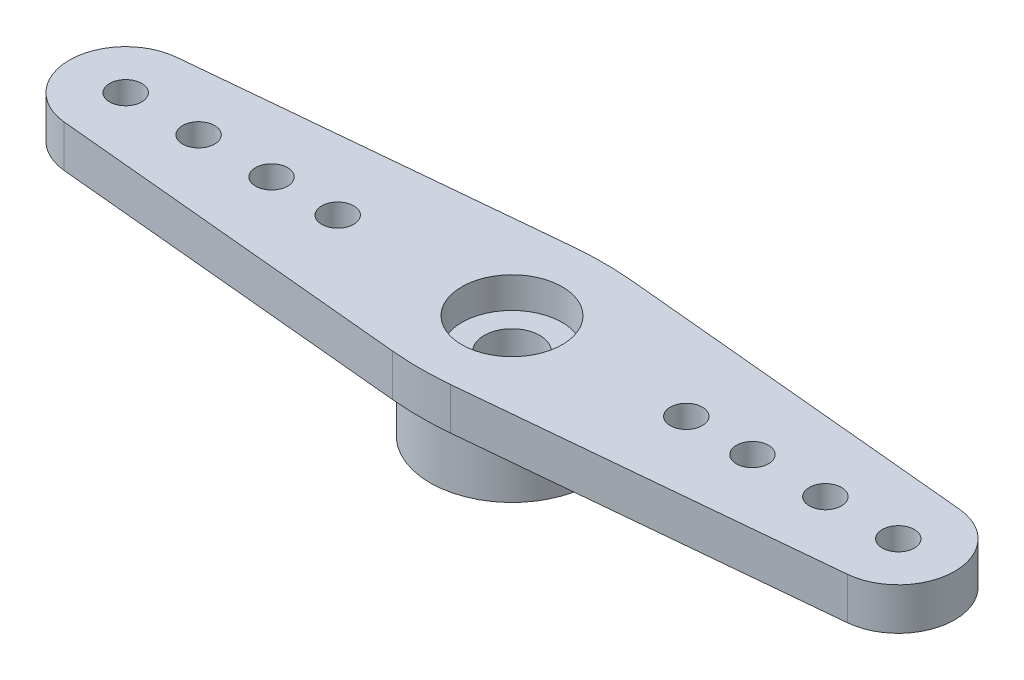
ISO-10303-21;
HEADER;
FILE_DESCRIPTION(('STEP AP214'),'2;1');
FILE_NAME('part.step','',(''),(''),'','','');
FILE_SCHEMA(('AUTOMOTIVE_DESIGN { 1 0 10303 214 1 1 1 1 }'));
ENDSEC;
DATA;
#1=APPLICATION_CONTEXT('core data for automotive mechanical design processes');
#2=APPLICATION_PROTOCOL_DEFINITION('international standard','automotive_design',2000,#1);
#3=PRODUCT_CONTEXT('',#1,'mechanical');
#4=PRODUCT('Part','Part','',(#3));
#5=PRODUCT_RELATED_PRODUCT_CATEGORY('part','',(#4));
#6=PRODUCT_DEFINITION_FORMATION('','',#4);
#7=PRODUCT_DEFINITION_CONTEXT('part definition',#1,'design');
#8=PRODUCT_DEFINITION('design','',#6,#7);
#9=PRODUCT_DEFINITION_SHAPE('','',#8);
#10=(LENGTH_UNIT() NAMED_UNIT(*) SI_UNIT(.MILLI.,.METRE.));
#11=(NAMED_UNIT(*) PLANE_ANGLE_UNIT() SI_UNIT($,.RADIAN.));
#12=(NAMED_UNIT(*) SI_UNIT($,.STERADIAN.) SOLID_ANGLE_UNIT());
#13=UNCERTAINTY_MEASURE_WITH_UNIT(LENGTH_MEASURE(1.E-05),#10,'distance_accuracy_value','');
#14=(GEOMETRIC_REPRESENTATION_CONTEXT(3) GLOBAL_UNCERTAINTY_ASSIGNED_CONTEXT((#13)) GLOBAL_UNIT_ASSIGNED_CONTEXT((#10,
#11,#12)) REPRESENTATION_CONTEXT('',''));
#15=CARTESIAN_POINT('',(0.,0.,0.));
#16=DIRECTION('',(0.,0.,1.));
#17=DIRECTION('',(1.,0.,0.));
#18=AXIS2_PLACEMENT_3D('',#15,#16,#17);
#19=CARTESIAN_POINT('',(0.,4.2672,0.));
#20=DIRECTION('',(0.,-1.,0.));
#21=DIRECTION('',(0.,0.,-1.));
#22=AXIS2_PLACEMENT_3D('',#19,#20,#21);
#23=CYLINDRICAL_SURFACE('',#22,1.143);
#24=CARTESIAN_POINT('',(0.,2.9972,0.));
#25=DIRECTION('',(0.,1.,0.));
#26=DIRECTION('',(0.,0.,1.));
#27=AXIS2_PLACEMENT_3D('',#24,#25,#26);
#28=CIRCLE('',#27,1.143);
#29=CARTESIAN_POINT('',(0.,2.9972,1.143));
#30=VERTEX_POINT('',#29);
#31=EDGE_CURVE('E324',#30,#30,#28,.F.);
#32=ORIENTED_EDGE('',*,*,#31,.F.);
#33=EDGE_LOOP('',(#32));
#34=FACE_BOUND('',#33,.T.);
#35=CARTESIAN_POINT('',(0.,-0.73,0.));
#36=DIRECTION('',(0.,-1.,0.));
#37=DIRECTION('',(0.,0.,-1.));
#38=AXIS2_PLACEMENT_3D('',#35,#36,#37);
#39=CIRCLE('',#38,1.143);
#40=CARTESIAN_POINT('',(0.,-0.73,-1.143));
#41=VERTEX_POINT('',#40);
#42=EDGE_CURVE('E327',#41,#41,#39,.T.);
#43=ORIENTED_EDGE('',*,*,#42,.T.);
#44=EDGE_LOOP('',(#43));
#45=FACE_BOUND('',#44,.T.);
#46=ADVANCED_FACE('F34',(#34,#45),#23,.F.);
#47=CARTESIAN_POINT('',(0.,0.,0.));
#48=DIRECTION('',(0.,1.,0.));
#49=DIRECTION('',(0.,0.,1.));
#50=AXIS2_PLACEMENT_3D('',#47,#48,#49);
#51=PLANE('',#50);
#52=CARTESIAN_POINT('',(0.,0.,0.));
#53=DIRECTION('',(0.,1.,0.));
#54=DIRECTION('',(0.,0.,1.));
#55=AXIS2_PLACEMENT_3D('',#52,#53,#54);
#56=CIRCLE('',#55,3.3655);
#57=CARTESIAN_POINT('',(0.,0.,3.3655));
#58=VERTEX_POINT('',#57);
#59=EDGE_CURVE('E119',#58,#58,#56,.T.);
#60=ORIENTED_EDGE('',*,*,#59,.F.);
#61=EDGE_LOOP('',(#60));
#62=FACE_BOUND('',#61,.T.);
#63=CARTESIAN_POINT('',(0.,0.,0.));
#64=DIRECTION('',(0.,1.,0.));
#65=DIRECTION('',(0.,0.,1.));
#66=AXIS2_PLACEMENT_3D('',#63,#64,#65);
#67=CIRCLE('',#66,2.2352);
#68=CARTESIAN_POINT('',(0.,0.,2.2352));
#69=VERTEX_POINT('',#68);
#70=EDGE_CURVE('E318',#69,#69,#67,.F.);
#71=ORIENTED_EDGE('',*,*,#70,.F.);
#72=EDGE_LOOP('',(#71));
#73=FACE_BOUND('',#72,.T.);
#74=ADVANCED_FACE('F247',(#62,#73),#51,.F.);
#75=CARTESIAN_POINT('',(0.,2.54,0.));
#76=DIRECTION('',(0.,-1.,0.));
#77=DIRECTION('',(0.,0.,-1.));
#78=AXIS2_PLACEMENT_3D('',#75,#76,#77);
#79=CYLINDRICAL_SURFACE('',#78,3.3655);
#80=CARTESIAN_POINT('',(0.,2.54,0.));
#81=DIRECTION('',(0.,1.,0.));
#82=DIRECTION('',(0.,0.,1.));
#83=AXIS2_PLACEMENT_3D('',#80,#81,#82);
#84=CIRCLE('',#83,3.3655);
#85=CARTESIAN_POINT('',(0.,2.54,3.3655));
#86=VERTEX_POINT('',#85);
#87=EDGE_CURVE('E202',#86,#86,#84,.T.);
#88=ORIENTED_EDGE('',*,*,#87,.F.);
#89=EDGE_LOOP('',(#88));
#90=FACE_BOUND('',#89,.T.);
#91=ORIENTED_EDGE('',*,*,#59,.T.);
#92=EDGE_LOOP('',(#91));
#93=FACE_BOUND('',#92,.T.);
#94=ADVANCED_FACE('F253',(#90,#93),#79,.T.);
#95=CARTESIAN_POINT('',(-29.0607200096115,2.54,0.));
#96=DIRECTION('',(0.,1.,0.));
#97=DIRECTION('',(0.,0.,1.));
#98=AXIS2_PLACEMENT_3D('',#95,#96,#97);
#99=PLANE('',#98);
#100=CARTESIAN_POINT('',(-9.8806,2.54,0.));
#101=DIRECTION('',(0.,1.,0.));
#102=DIRECTION('',(0.,0.,1.));
#103=AXIS2_PLACEMENT_3D('',#100,#101,#102);
#104=CIRCLE('',#103,0.6604);
#105=CARTESIAN_POINT('',(-9.8806,2.54,0.6604));
#106=VERTEX_POINT('',#105);
#107=EDGE_CURVE('E159',#106,#106,#104,.F.);
#108=ORIENTED_EDGE('',*,*,#107,.F.);
#109=EDGE_LOOP('',(#108));
#110=FACE_BOUND('',#109,.T.);
#111=DIRECTION('',(-0.995596740434201,0.,0.0937396950965555));
#112=VECTOR('',#111,1.);
#113=CARTESIAN_POINT('',(-29.162120546294,2.54,-1.07696151236052));
#114=LINE('',#113,#112);
#115=CARTESIAN_POINT('',(-1.19049412772623,2.54,-3.71060988156648));
#116=VERTEX_POINT('',#115);
#117=CARTESIAN_POINT('',(-16.09226517831,2.54,-2.30754434514137));
#118=VERTEX_POINT('',#117);
#119=EDGE_CURVE('E115',#116,#118,#114,.T.);
#120=ORIENTED_EDGE('',*,*,#119,.F.);
#121=CARTESIAN_POINT('',(0.,2.54,8.93346872194787));
#122=DIRECTION('',(0.,1.,0.));
#123=DIRECTION('',(0.,0.,1.));
#124=AXIS2_PLACEMENT_3D('',#121,#122,#123);
#125=CIRCLE('',#124,12.7);
#126=CARTESIAN_POINT('',(1.19049412772628,2.54,-3.71060988156648));
#127=VERTEX_POINT('',#126);
#128=EDGE_CURVE('E211',#116,#127,#125,.F.);
#129=ORIENTED_EDGE('',*,*,#128,.T.);
#130=DIRECTION('',(0.995596740434201,0.,0.0937396950965555));
#131=VECTOR('',#130,1.);
#132=CARTESIAN_POINT('',(-28.4485987983057,2.54,-6.50125736059801));
#133=LINE('',#132,#131);
#134=CARTESIAN_POINT('',(16.09226517831,2.54,-2.30754434514137));
#135=VERTEX_POINT('',#134);
#136=EDGE_CURVE('E173',#127,#135,#133,.T.);
#137=ORIENTED_EDGE('',*,*,#136,.T.);
#138=CARTESIAN_POINT('',(15.875,2.54,0.));
#139=DIRECTION('',(0.,1.,0.));
#140=DIRECTION('',(0.,0.,1.));
#141=AXIS2_PLACEMENT_3D('',#138,#139,#140);
#142=CIRCLE('',#141,2.31775);
#143=CARTESIAN_POINT('',(16.09226517831,2.54,2.30754434514137));
#144=VERTEX_POINT('',#143);
#145=EDGE_CURVE('E170',#144,#135,#142,.T.);
#146=ORIENTED_EDGE('',*,*,#145,.F.);
#147=DIRECTION('',(0.995596740434201,0.,-0.0937396950965555));
#148=VECTOR('',#147,1.);
#149=CARTESIAN_POINT('',(-28.4485987983057,2.54,6.50125736059801));
#150=LINE('',#149,#148);
#151=CARTESIAN_POINT('',(1.19049412772627,2.54,3.71060988156648));
#152=VERTEX_POINT('',#151);
#153=EDGE_CURVE('E168',#152,#144,#150,.T.);
#154=ORIENTED_EDGE('',*,*,#153,.F.);
#155=CARTESIAN_POINT('',(0.,2.54,-8.93346872194787));
#156=DIRECTION('',(0.,1.,0.));
#157=DIRECTION('',(0.,0.,1.));
#158=AXIS2_PLACEMENT_3D('',#155,#156,#157);
#159=CIRCLE('',#158,12.7);
#160=CARTESIAN_POINT('',(-1.19049412772624,2.54,3.71060988156648));
#161=VERTEX_POINT('',#160);
#162=EDGE_CURVE('E209',#152,#161,#159,.F.);
#163=ORIENTED_EDGE('',*,*,#162,.T.);
#164=DIRECTION('',(-0.995596740434201,0.,-0.0937396950965555));
#165=VECTOR('',#164,1.);
#166=CARTESIAN_POINT('',(-29.162120546294,2.54,1.07696151236052));
#167=LINE('',#166,#165);
#168=CARTESIAN_POINT('',(-16.09226517831,2.54,2.30754434514137));
#169=VERTEX_POINT('',#168);
#170=EDGE_CURVE('E166',#161,#169,#167,.T.);
#171=ORIENTED_EDGE('',*,*,#170,.T.);
#172=CARTESIAN_POINT('',(-15.875,2.54,0.));
#173=DIRECTION('',(0.,1.,0.));
#174=DIRECTION('',(0.,0.,1.));
#175=AXIS2_PLACEMENT_3D('',#172,#173,#174);
#176=CIRCLE('',#175,2.31775);
#177=EDGE_CURVE('E164',#169,#118,#176,.F.);
#178=ORIENTED_EDGE('',*,*,#177,.T.);
#179=EDGE_LOOP('',(#120,#129,#137,#146,#154,#163,#171,#178));
#180=FACE_BOUND('',#179,.T.);
#181=CARTESIAN_POINT('',(-7.1628,2.54,0.));
#182=DIRECTION('',(0.,1.,0.));
#183=DIRECTION('',(0.,0.,1.));
#184=AXIS2_PLACEMENT_3D('',#181,#182,#183);
#185=CIRCLE('',#184,0.6604);
#186=CARTESIAN_POINT('',(-7.1628,2.54,0.6604));
#187=VERTEX_POINT('',#186);
#188=EDGE_CURVE('E175',#187,#187,#185,.F.);
#189=ORIENTED_EDGE('',*,*,#188,.F.);
#190=EDGE_LOOP('',(#189));
#191=FACE_BOUND('',#190,.T.);
#192=CARTESIAN_POINT('',(-12.8778,2.54,0.));
#193=DIRECTION('',(0.,1.,0.));
#194=DIRECTION('',(0.,0.,1.));
#195=AXIS2_PLACEMENT_3D('',#192,#193,#194);
#196=CIRCLE('',#195,0.660399999999998);
#197=CARTESIAN_POINT('',(-12.8778,2.54,0.660399999999998));
#198=VERTEX_POINT('',#197);
#199=EDGE_CURVE('E178',#198,#198,#196,.F.);
#200=ORIENTED_EDGE('',*,*,#199,.F.);
#201=EDGE_LOOP('',(#200));
#202=FACE_BOUND('',#201,.T.);
#203=CARTESIAN_POINT('',(-15.875,2.54,0.));
#204=DIRECTION('',(0.,1.,0.));
#205=DIRECTION('',(0.,0.,1.));
#206=AXIS2_PLACEMENT_3D('',#203,#204,#205);
#207=CIRCLE('',#206,0.660399999999998);
#208=CARTESIAN_POINT('',(-15.875,2.54,0.660399999999998));
#209=VERTEX_POINT('',#208);
#210=EDGE_CURVE('E181',#209,#209,#207,.F.);
#211=ORIENTED_EDGE('',*,*,#210,.F.);
#212=EDGE_LOOP('',(#211));
#213=FACE_BOUND('',#212,.T.);
#214=CARTESIAN_POINT('',(12.8778,2.54,0.));
#215=DIRECTION('',(0.,1.,0.));
#216=DIRECTION('',(0.,0.,1.));
#217=AXIS2_PLACEMENT_3D('',#214,#215,#216);
#218=CIRCLE('',#217,0.660399999999998);
#219=CARTESIAN_POINT('',(12.8778,2.54,0.660399999999998));
#220=VERTEX_POINT('',#219);
#221=EDGE_CURVE('E184',#220,#220,#218,.T.);
#222=ORIENTED_EDGE('',*,*,#221,.T.);
#223=EDGE_LOOP('',(#222));
#224=FACE_BOUND('',#223,.T.);
#225=CARTESIAN_POINT('',(9.8806,2.54,0.));
#226=DIRECTION('',(0.,1.,0.));
#227=DIRECTION('',(0.,0.,1.));
#228=AXIS2_PLACEMENT_3D('',#225,#226,#227);
#229=CIRCLE('',#228,0.6604);
#230=CARTESIAN_POINT('',(9.8806,2.54,0.6604));
#231=VERTEX_POINT('',#230);
#232=EDGE_CURVE('E187',#231,#231,#229,.T.);
#233=ORIENTED_EDGE('',*,*,#232,.T.);
#234=EDGE_LOOP('',(#233));
#235=FACE_BOUND('',#234,.T.);
#236=CARTESIAN_POINT('',(7.1628,2.54,0.));
#237=DIRECTION('',(0.,1.,0.));
#238=DIRECTION('',(0.,0.,1.));
#239=AXIS2_PLACEMENT_3D('',#236,#237,#238);
#240=CIRCLE('',#239,0.6604);
#241=CARTESIAN_POINT('',(7.1628,2.54,0.6604));
#242=VERTEX_POINT('',#241);
#243=EDGE_CURVE('E190',#242,#242,#240,.T.);
#244=ORIENTED_EDGE('',*,*,#243,.T.);
#245=EDGE_LOOP('',(#244));
#246=FACE_BOUND('',#245,.T.);
#247=CARTESIAN_POINT('',(15.875,2.54,0.));
#248=DIRECTION('',(0.,1.,0.));
#249=DIRECTION('',(0.,0.,1.));
#250=AXIS2_PLACEMENT_3D('',#247,#248,#249);
#251=CIRCLE('',#250,0.660399999999998);
#252=CARTESIAN_POINT('',(15.875,2.54,0.660399999999998));
#253=VERTEX_POINT('',#252);
#254=EDGE_CURVE('E193',#253,#253,#251,.T.);
#255=ORIENTED_EDGE('',*,*,#254,.T.);
#256=EDGE_LOOP('',(#255));
#257=FACE_BOUND('',#256,.T.);
#258=ORIENTED_EDGE('',*,*,#87,.T.);
#259=EDGE_LOOP('',(#258));
#260=FACE_BOUND('',#259,.T.);
#261=ADVANCED_FACE('F225',(#110,#180,#191,#202,#213,#224,#235,#246,#257,#260),#99,.F.);
#262=CARTESIAN_POINT('',(-29.162120546294,4.2672,-1.07696151236052));
#263=DIRECTION('',(0.0937396950965555,0.,0.995596740434201));
#264=DIRECTION('',(0.995596740434201,0.,-0.0937396950965555));
#265=AXIS2_PLACEMENT_3D('',#262,#263,#264);
#266=PLANE('',#265);
#267=DIRECTION('',(-0.995596740434201,0.,0.0937396950965555));
#268=VECTOR('',#267,1.);
#269=CARTESIAN_POINT('',(-29.162120546294,4.2672,-1.07696151236052));
#270=LINE('',#269,#268);
#271=CARTESIAN_POINT('',(-1.19049412772623,4.2672,-3.71060988156648));
#272=VERTEX_POINT('',#271);
#273=CARTESIAN_POINT('',(-16.09226517831,4.2672,-2.30754434514137));
#274=VERTEX_POINT('',#273);
#275=EDGE_CURVE('E97',#272,#274,#270,.T.);
#276=ORIENTED_EDGE('',*,*,#275,.F.);
#277=DIRECTION('',(0.,-1.,0.));
#278=VECTOR('',#277,1.);
#279=CARTESIAN_POINT('',(-1.19049412772624,2.54,-3.71060988156648));
#280=LINE('',#279,#278);
#281=EDGE_CURVE('E205',#272,#116,#280,.T.);
#282=ORIENTED_EDGE('',*,*,#281,.T.);
#283=ORIENTED_EDGE('',*,*,#119,.T.);
#284=DIRECTION('',(0.,-1.,0.));
#285=VECTOR('',#284,1.);
#286=CARTESIAN_POINT('',(-16.09226517831,4.2672,-2.30754434514137));
#287=LINE('',#286,#285);
#288=EDGE_CURVE('E112',#274,#118,#287,.T.);
#289=ORIENTED_EDGE('',*,*,#288,.F.);
#290=EDGE_LOOP('',(#276,#282,#283,#289));
#291=FACE_BOUND('',#290,.T.);
#292=ADVANCED_FACE('F113',(#291),#266,.F.);
#293=CARTESIAN_POINT('',(-15.875,4.2672,0.));
#294=DIRECTION('',(0.,-1.,0.));
#295=DIRECTION('',(0.,0.,-1.));
#296=AXIS2_PLACEMENT_3D('',#293,#294,#295);
#297=CYLINDRICAL_SURFACE('',#296,2.31775);
#298=ORIENTED_EDGE('',*,*,#177,.F.);
#299=DIRECTION('',(0.,-1.,0.));
#300=VECTOR('',#299,1.);
#301=CARTESIAN_POINT('',(-16.09226517831,4.2672,2.30754434514137));
#302=LINE('',#301,#300);
#303=CARTESIAN_POINT('',(-16.09226517831,4.2672,2.30754434514137));
#304=VERTEX_POINT('',#303);
#305=EDGE_CURVE('E120',#304,#169,#302,.T.);
#306=ORIENTED_EDGE('',*,*,#305,.F.);
#307=CARTESIAN_POINT('',(-15.875,4.2672,0.));
#308=DIRECTION('',(0.,1.,0.));
#309=DIRECTION('',(0.,0.,1.));
#310=AXIS2_PLACEMENT_3D('',#307,#308,#309);
#311=CIRCLE('',#310,2.31775);
#312=EDGE_CURVE('E103',#304,#274,#311,.F.);
#313=ORIENTED_EDGE('',*,*,#312,.T.);
#314=ORIENTED_EDGE('',*,*,#288,.T.);
#315=EDGE_LOOP('',(#298,#306,#313,#314));
#316=FACE_BOUND('',#315,.T.);
#317=ADVANCED_FACE('F123',(#316),#297,.T.);
#318=CARTESIAN_POINT('',(-29.162120546294,4.2672,1.07696151236052));
#319=DIRECTION('',(-0.0937396950965555,0.,0.995596740434201));
#320=DIRECTION('',(0.995596740434201,0.,0.0937396950965555));
#321=AXIS2_PLACEMENT_3D('',#318,#319,#320);
#322=PLANE('',#321);
#323=ORIENTED_EDGE('',*,*,#170,.F.);
#324=DIRECTION('',(0.,-1.,0.));
#325=VECTOR('',#324,1.);
#326=CARTESIAN_POINT('',(-1.19049412772625,4.2672,3.71060988156648));
#327=LINE('',#326,#325);
#328=CARTESIAN_POINT('',(-1.19049412772624,4.2672,3.71060988156648));
#329=VERTEX_POINT('',#328);
#330=EDGE_CURVE('E11',#161,#329,#327,.F.);
#331=ORIENTED_EDGE('',*,*,#330,.T.);
#332=DIRECTION('',(-0.995596740434201,0.,-0.0937396950965555));
#333=VECTOR('',#332,1.);
#334=CARTESIAN_POINT('',(-29.162120546294,4.2672,1.07696151236052));
#335=LINE('',#334,#333);
#336=EDGE_CURVE('E125',#329,#304,#335,.T.);
#337=ORIENTED_EDGE('',*,*,#336,.T.);
#338=ORIENTED_EDGE('',*,*,#305,.T.);
#339=EDGE_LOOP('',(#323,#331,#337,#338));
#340=FACE_BOUND('',#339,.T.);
#341=ADVANCED_FACE('F236',(#340),#322,.T.);
#342=CARTESIAN_POINT('',(-28.4485987983057,4.2672,6.50125736059801));
#343=DIRECTION('',(-0.0937396950965555,0.,-0.995596740434201));
#344=DIRECTION('',(-0.995596740434201,0.,0.0937396950965555));
#345=AXIS2_PLACEMENT_3D('',#342,#343,#344);
#346=PLANE('',#345);
#347=DIRECTION('',(0.995596740434201,0.,-0.0937396950965555));
#348=VECTOR('',#347,1.);
#349=CARTESIAN_POINT('',(-28.4485987983057,4.2672,6.50125736059801));
#350=LINE('',#349,#348);
#351=CARTESIAN_POINT('',(1.19049412772627,4.2672,3.71060988156648));
#352=VERTEX_POINT('',#351);
#353=CARTESIAN_POINT('',(16.09226517831,4.2672,2.30754434514137));
#354=VERTEX_POINT('',#353);
#355=EDGE_CURVE('E127',#352,#354,#350,.T.);
#356=ORIENTED_EDGE('',*,*,#355,.F.);
#357=DIRECTION('',(0.,-1.,0.));
#358=VECTOR('',#357,1.);
#359=CARTESIAN_POINT('',(1.19049412772626,2.54,3.71060988156648));
#360=LINE('',#359,#358);
#361=EDGE_CURVE('E42',#352,#152,#360,.T.);
#362=ORIENTED_EDGE('',*,*,#361,.T.);
#363=ORIENTED_EDGE('',*,*,#153,.T.);
#364=DIRECTION('',(0.,-1.,0.));
#365=VECTOR('',#364,1.);
#366=CARTESIAN_POINT('',(16.09226517831,4.2672,2.30754434514137));
#367=LINE('',#366,#365);
#368=EDGE_CURVE('E198',#354,#144,#367,.T.);
#369=ORIENTED_EDGE('',*,*,#368,.F.);
#370=EDGE_LOOP('',(#356,#362,#363,#369));
#371=FACE_BOUND('',#370,.T.);
#372=ADVANCED_FACE('F220',(#371),#346,.F.);
#373=CARTESIAN_POINT('',(15.875,4.2672,0.));
#374=DIRECTION('',(0.,-1.,0.));
#375=DIRECTION('',(0.,0.,-1.));
#376=AXIS2_PLACEMENT_3D('',#373,#374,#375);
#377=CYLINDRICAL_SURFACE('',#376,2.31775);
#378=ORIENTED_EDGE('',*,*,#145,.T.);
#379=DIRECTION('',(0.,-1.,0.));
#380=VECTOR('',#379,1.);
#381=CARTESIAN_POINT('',(16.09226517831,4.2672,-2.30754434514137));
#382=LINE('',#381,#380);
#383=CARTESIAN_POINT('',(16.09226517831,4.2672,-2.30754434514137));
#384=VERTEX_POINT('',#383);
#385=EDGE_CURVE('E158',#384,#135,#382,.T.);
#386=ORIENTED_EDGE('',*,*,#385,.F.);
#387=CARTESIAN_POINT('',(15.875,4.2672,0.));
#388=DIRECTION('',(0.,1.,0.));
#389=DIRECTION('',(0.,0.,1.));
#390=AXIS2_PLACEMENT_3D('',#387,#388,#389);
#391=CIRCLE('',#390,2.31775);
#392=EDGE_CURVE('E132',#354,#384,#391,.T.);
#393=ORIENTED_EDGE('',*,*,#392,.F.);
#394=ORIENTED_EDGE('',*,*,#368,.T.);
#395=EDGE_LOOP('',(#378,#386,#393,#394));
#396=FACE_BOUND('',#395,.T.);
#397=ADVANCED_FACE('F230',(#396),#377,.T.);
#398=CARTESIAN_POINT('',(15.875,4.2672,0.));
#399=DIRECTION('',(0.,-1.,0.));
#400=DIRECTION('',(0.,0.,-1.));
#401=AXIS2_PLACEMENT_3D('',#398,#399,#400);
#402=CYLINDRICAL_SURFACE('',#401,0.660399999999998);
#403=CARTESIAN_POINT('',(15.875,4.2672,0.));
#404=DIRECTION('',(0.,1.,0.));
#405=DIRECTION('',(0.,0.,1.));
#406=AXIS2_PLACEMENT_3D('',#403,#404,#405);
#407=CIRCLE('',#406,0.660399999999998);
#408=CARTESIAN_POINT('',(15.875,4.2672,0.660399999999998));
#409=VERTEX_POINT('',#408);
#410=EDGE_CURVE('E155',#409,#409,#407,.T.);
#411=ORIENTED_EDGE('',*,*,#410,.T.);
#412=EDGE_LOOP('',(#411));
#413=FACE_BOUND('',#412,.T.);
#414=ORIENTED_EDGE('',*,*,#254,.F.);
#415=EDGE_LOOP('',(#414));
#416=FACE_BOUND('',#415,.T.);
#417=ADVANCED_FACE('F261',(#413,#416),#402,.F.);
#418=CARTESIAN_POINT('',(7.1628,4.2672,0.));
#419=DIRECTION('',(0.,-1.,0.));
#420=DIRECTION('',(0.,0.,-1.));
#421=AXIS2_PLACEMENT_3D('',#418,#419,#420);
#422=CYLINDRICAL_SURFACE('',#421,0.6604);
#423=CARTESIAN_POINT('',(7.1628,4.2672,0.));
#424=DIRECTION('',(0.,1.,0.));
#425=DIRECTION('',(0.,0.,1.));
#426=AXIS2_PLACEMENT_3D('',#423,#424,#425);
#427=CIRCLE('',#426,0.6604);
#428=CARTESIAN_POINT('',(7.1628,4.2672,0.6604));
#429=VERTEX_POINT('',#428);
#430=EDGE_CURVE('E152',#429,#429,#427,.T.);
#431=ORIENTED_EDGE('',*,*,#430,.T.);
#432=EDGE_LOOP('',(#431));
#433=FACE_BOUND('',#432,.T.);
#434=ORIENTED_EDGE('',*,*,#243,.F.);
#435=EDGE_LOOP('',(#434));
#436=FACE_BOUND('',#435,.T.);
#437=ADVANCED_FACE('F264',(#433,#436),#422,.F.);
#438=CARTESIAN_POINT('',(9.8806,4.2672,0.));
#439=DIRECTION('',(0.,-1.,0.));
#440=DIRECTION('',(0.,0.,-1.));
#441=AXIS2_PLACEMENT_3D('',#438,#439,#440);
#442=CYLINDRICAL_SURFACE('',#441,0.6604);
#443=CARTESIAN_POINT('',(9.8806,4.2672,0.));
#444=DIRECTION('',(0.,1.,0.));
#445=DIRECTION('',(0.,0.,1.));
#446=AXIS2_PLACEMENT_3D('',#443,#444,#445);
#447=CIRCLE('',#446,0.6604);
#448=CARTESIAN_POINT('',(9.8806,4.2672,0.6604));
#449=VERTEX_POINT('',#448);
#450=EDGE_CURVE('E149',#449,#449,#447,.T.);
#451=ORIENTED_EDGE('',*,*,#450,.T.);
#452=EDGE_LOOP('',(#451));
#453=FACE_BOUND('',#452,.T.);
#454=ORIENTED_EDGE('',*,*,#232,.F.);
#455=EDGE_LOOP('',(#454));
#456=FACE_BOUND('',#455,.T.);
#457=ADVANCED_FACE('F268',(#453,#456),#442,.F.);
#458=CARTESIAN_POINT('',(12.8778,4.2672,0.));
#459=DIRECTION('',(0.,-1.,0.));
#460=DIRECTION('',(0.,0.,-1.));
#461=AXIS2_PLACEMENT_3D('',#458,#459,#460);
#462=CYLINDRICAL_SURFACE('',#461,0.660399999999998);
#463=CARTESIAN_POINT('',(12.8778,4.2672,0.));
#464=DIRECTION('',(0.,1.,0.));
#465=DIRECTION('',(0.,0.,1.));
#466=AXIS2_PLACEMENT_3D('',#463,#464,#465);
#467=CIRCLE('',#466,0.660399999999998);
#468=CARTESIAN_POINT('',(12.8778,4.2672,0.660399999999998));
#469=VERTEX_POINT('',#468);
#470=EDGE_CURVE('E146',#469,#469,#467,.T.);
#471=ORIENTED_EDGE('',*,*,#470,.T.);
#472=EDGE_LOOP('',(#471));
#473=FACE_BOUND('',#472,.T.);
#474=ORIENTED_EDGE('',*,*,#221,.F.);
#475=EDGE_LOOP('',(#474));
#476=FACE_BOUND('',#475,.T.);
#477=ADVANCED_FACE('F272',(#473,#476),#462,.F.);
#478=CARTESIAN_POINT('',(-15.875,4.2672,0.));
#479=DIRECTION('',(0.,-1.,0.));
#480=DIRECTION('',(0.,0.,-1.));
#481=AXIS2_PLACEMENT_3D('',#478,#479,#480);
#482=CYLINDRICAL_SURFACE('',#481,0.660399999999998);
#483=CARTESIAN_POINT('',(-15.875,4.2672,0.));
#484=DIRECTION('',(0.,1.,0.));
#485=DIRECTION('',(0.,0.,1.));
#486=AXIS2_PLACEMENT_3D('',#483,#484,#485);
#487=CIRCLE('',#486,0.660399999999998);
#488=CARTESIAN_POINT('',(-15.875,4.2672,0.660399999999998));
#489=VERTEX_POINT('',#488);
#490=EDGE_CURVE('E143',#489,#489,#487,.F.);
#491=ORIENTED_EDGE('',*,*,#490,.F.);
#492=EDGE_LOOP('',(#491));
#493=FACE_BOUND('',#492,.T.);
#494=ORIENTED_EDGE('',*,*,#210,.T.);
#495=EDGE_LOOP('',(#494));
#496=FACE_BOUND('',#495,.T.);
#497=ADVANCED_FACE('F276',(#493,#496),#482,.F.);
#498=CARTESIAN_POINT('',(-12.8778,4.2672,0.));
#499=DIRECTION('',(0.,-1.,0.));
#500=DIRECTION('',(0.,0.,-1.));
#501=AXIS2_PLACEMENT_3D('',#498,#499,#500);
#502=CYLINDRICAL_SURFACE('',#501,0.660399999999998);
#503=CARTESIAN_POINT('',(-12.8778,4.2672,0.));
#504=DIRECTION('',(0.,1.,0.));
#505=DIRECTION('',(0.,0.,1.));
#506=AXIS2_PLACEMENT_3D('',#503,#504,#505);
#507=CIRCLE('',#506,0.660399999999998);
#508=CARTESIAN_POINT('',(-12.8778,4.2672,0.660399999999998));
#509=VERTEX_POINT('',#508);
#510=EDGE_CURVE('E140',#509,#509,#507,.F.);
#511=ORIENTED_EDGE('',*,*,#510,.F.);
#512=EDGE_LOOP('',(#511));
#513=FACE_BOUND('',#512,.T.);
#514=ORIENTED_EDGE('',*,*,#199,.T.);
#515=EDGE_LOOP('',(#514));
#516=FACE_BOUND('',#515,.T.);
#517=ADVANCED_FACE('F280',(#513,#516),#502,.F.);
#518=CARTESIAN_POINT('',(-7.1628,4.2672,0.));
#519=DIRECTION('',(0.,-1.,0.));
#520=DIRECTION('',(0.,0.,-1.));
#521=AXIS2_PLACEMENT_3D('',#518,#519,#520);
#522=CYLINDRICAL_SURFACE('',#521,0.6604);
#523=CARTESIAN_POINT('',(-7.1628,4.2672,0.));
#524=DIRECTION('',(0.,1.,0.));
#525=DIRECTION('',(0.,0.,1.));
#526=AXIS2_PLACEMENT_3D('',#523,#524,#525);
#527=CIRCLE('',#526,0.6604);
#528=CARTESIAN_POINT('',(-7.1628,4.2672,0.6604));
#529=VERTEX_POINT('',#528);
#530=EDGE_CURVE('E137',#529,#529,#527,.F.);
#531=ORIENTED_EDGE('',*,*,#530,.F.);
#532=EDGE_LOOP('',(#531));
#533=FACE_BOUND('',#532,.T.);
#534=ORIENTED_EDGE('',*,*,#188,.T.);
#535=EDGE_LOOP('',(#534));
#536=FACE_BOUND('',#535,.T.);
#537=ADVANCED_FACE('F284',(#533,#536),#522,.F.);
#538=CARTESIAN_POINT('',(-28.4485987983057,4.2672,-6.50125736059801));
#539=DIRECTION('',(0.0937396950965555,0.,-0.995596740434201));
#540=DIRECTION('',(-0.995596740434201,0.,-0.0937396950965555));
#541=AXIS2_PLACEMENT_3D('',#538,#539,#540);
#542=PLANE('',#541);
#543=ORIENTED_EDGE('',*,*,#136,.F.);
#544=DIRECTION('',(0.,-1.,0.));
#545=VECTOR('',#544,1.);
#546=CARTESIAN_POINT('',(1.19049412772627,4.2672,-3.71060988156648));
#547=LINE('',#546,#545);
#548=CARTESIAN_POINT('',(1.19049412772628,4.2672,-3.71060988156648));
#549=VERTEX_POINT('',#548);
#550=EDGE_CURVE('E213',#127,#549,#547,.F.);
#551=ORIENTED_EDGE('',*,*,#550,.T.);
#552=DIRECTION('',(0.995596740434201,0.,0.0937396950965555));
#553=VECTOR('',#552,1.);
#554=CARTESIAN_POINT('',(-28.4485987983057,4.2672,-6.50125736059801));
#555=LINE('',#554,#553);
#556=EDGE_CURVE('E135',#549,#384,#555,.T.);
#557=ORIENTED_EDGE('',*,*,#556,.T.);
#558=ORIENTED_EDGE('',*,*,#385,.T.);
#559=EDGE_LOOP('',(#543,#551,#557,#558));
#560=FACE_BOUND('',#559,.T.);
#561=ADVANCED_FACE('F288',(#560),#542,.T.);
#562=CARTESIAN_POINT('',(-9.8806,4.2672,0.));
#563=DIRECTION('',(0.,-1.,0.));
#564=DIRECTION('',(0.,0.,-1.));
#565=AXIS2_PLACEMENT_3D('',#562,#563,#564);
#566=CYLINDRICAL_SURFACE('',#565,0.6604);
#567=CARTESIAN_POINT('',(-9.8806,4.2672,0.));
#568=DIRECTION('',(0.,1.,0.));
#569=DIRECTION('',(0.,0.,1.));
#570=AXIS2_PLACEMENT_3D('',#567,#568,#569);
#571=CIRCLE('',#570,0.6604);
#572=CARTESIAN_POINT('',(-9.8806,4.2672,0.6604));
#573=VERTEX_POINT('',#572);
#574=EDGE_CURVE('E109',#573,#573,#571,.F.);
#575=ORIENTED_EDGE('',*,*,#574,.F.);
#576=EDGE_LOOP('',(#575));
#577=FACE_BOUND('',#576,.T.);
#578=ORIENTED_EDGE('',*,*,#107,.T.);
#579=EDGE_LOOP('',(#578));
#580=FACE_BOUND('',#579,.T.);
#581=ADVANCED_FACE('F292',(#577,#580),#566,.F.);
#582=CARTESIAN_POINT('',(-29.0607200096115,4.2672,0.));
#583=DIRECTION('',(0.,1.,0.));
#584=DIRECTION('',(0.,0.,1.));
#585=AXIS2_PLACEMENT_3D('',#582,#583,#584);
#586=PLANE('',#585);
#587=CARTESIAN_POINT('',(0.,4.2672,0.));
#588=DIRECTION('',(0.,1.,0.));
#589=DIRECTION('',(0.,0.,1.));
#590=AXIS2_PLACEMENT_3D('',#587,#588,#589);
#591=CIRCLE('',#590,2.06375);
#592=CARTESIAN_POINT('',(0.,4.2672,2.06375));
#593=VERTEX_POINT('',#592);
#594=EDGE_CURVE('E320',#593,#593,#591,.T.);
#595=ORIENTED_EDGE('',*,*,#594,.F.);
#596=EDGE_LOOP('',(#595));
#597=FACE_BOUND('',#596,.T.);
#598=ORIENTED_EDGE('',*,*,#574,.T.);
#599=EDGE_LOOP('',(#598));
#600=FACE_BOUND('',#599,.T.);
#601=ORIENTED_EDGE('',*,*,#556,.F.);
#602=CARTESIAN_POINT('',(0.,4.2672,8.93346872194787));
#603=DIRECTION('',(0.,1.,0.));
#604=DIRECTION('',(0.,0.,1.));
#605=AXIS2_PLACEMENT_3D('',#602,#603,#604);
#606=CIRCLE('',#605,12.7);
#607=EDGE_CURVE('E105',#549,#272,#606,.T.);
#608=ORIENTED_EDGE('',*,*,#607,.T.);
#609=ORIENTED_EDGE('',*,*,#275,.T.);
#610=ORIENTED_EDGE('',*,*,#312,.F.);
#611=ORIENTED_EDGE('',*,*,#336,.F.);
#612=CARTESIAN_POINT('',(0.,4.2672,-8.93346872194787));
#613=DIRECTION('',(0.,1.,0.));
#614=DIRECTION('',(0.,0.,1.));
#615=AXIS2_PLACEMENT_3D('',#612,#613,#614);
#616=CIRCLE('',#615,12.7);
#617=EDGE_CURVE('E49',#329,#352,#616,.T.);
#618=ORIENTED_EDGE('',*,*,#617,.T.);
#619=ORIENTED_EDGE('',*,*,#355,.T.);
#620=ORIENTED_EDGE('',*,*,#392,.T.);
#621=EDGE_LOOP('',(#601,#608,#609,#610,#611,#618,#619,#620));
#622=FACE_BOUND('',#621,.T.);
#623=ORIENTED_EDGE('',*,*,#530,.T.);
#624=EDGE_LOOP('',(#623));
#625=FACE_BOUND('',#624,.T.);
#626=ORIENTED_EDGE('',*,*,#510,.T.);
#627=EDGE_LOOP('',(#626));
#628=FACE_BOUND('',#627,.T.);
#629=ORIENTED_EDGE('',*,*,#490,.T.);
#630=EDGE_LOOP('',(#629));
#631=FACE_BOUND('',#630,.T.);
#632=ORIENTED_EDGE('',*,*,#470,.F.);
#633=EDGE_LOOP('',(#632));
#634=FACE_BOUND('',#633,.T.);
#635=ORIENTED_EDGE('',*,*,#450,.F.);
#636=EDGE_LOOP('',(#635));
#637=FACE_BOUND('',#636,.T.);
#638=ORIENTED_EDGE('',*,*,#430,.F.);
#639=EDGE_LOOP('',(#638));
#640=FACE_BOUND('',#639,.T.);
#641=ORIENTED_EDGE('',*,*,#410,.F.);
#642=EDGE_LOOP('',(#641));
#643=FACE_BOUND('',#642,.T.);
#644=ADVANCED_FACE('F100',(#597,#600,#622,#625,#628,#631,#634,#637,#640,#643),#586,.T.);
#645=CARTESIAN_POINT('',(0.,4.2672,8.93346872194787));
#646=DIRECTION('',(0.,1.,0.));
#647=DIRECTION('',(0.,0.,1.));
#648=AXIS2_PLACEMENT_3D('',#645,#646,#647);
#649=CYLINDRICAL_SURFACE('',#648,12.7);
#650=ORIENTED_EDGE('',*,*,#607,.F.);
#651=ORIENTED_EDGE('',*,*,#550,.F.);
#652=ORIENTED_EDGE('',*,*,#128,.F.);
#653=ORIENTED_EDGE('',*,*,#281,.F.);
#654=EDGE_LOOP('',(#650,#651,#652,#653));
#655=FACE_BOUND('',#654,.T.);
#656=ADVANCED_FACE('F235',(#655),#649,.T.);
#657=CARTESIAN_POINT('',(0.,4.2672,-8.93346872194787));
#658=DIRECTION('',(0.,1.,0.));
#659=DIRECTION('',(0.,0.,1.));
#660=AXIS2_PLACEMENT_3D('',#657,#658,#659);
#661=CYLINDRICAL_SURFACE('',#660,12.7);
#662=ORIENTED_EDGE('',*,*,#617,.F.);
#663=ORIENTED_EDGE('',*,*,#330,.F.);
#664=ORIENTED_EDGE('',*,*,#162,.F.);
#665=ORIENTED_EDGE('',*,*,#361,.F.);
#666=EDGE_LOOP('',(#662,#663,#664,#665));
#667=FACE_BOUND('',#666,.T.);
#668=ADVANCED_FACE('F36',(#667),#661,.T.);
#669=CARTESIAN_POINT('',(0.,2.9972,0.));
#670=DIRECTION('',(0.,1.,0.));
#671=DIRECTION('',(0.,0.,1.));
#672=AXIS2_PLACEMENT_3D('',#669,#670,#671);
#673=CYLINDRICAL_SURFACE('',#672,2.06375);
#674=CARTESIAN_POINT('',(0.,2.9972,0.));
#675=DIRECTION('',(0.,1.,0.));
#676=DIRECTION('',(0.,0.,1.));
#677=AXIS2_PLACEMENT_3D('',#674,#675,#676);
#678=CIRCLE('',#677,2.06375);
#679=CARTESIAN_POINT('',(0.,2.9972,2.06375));
#680=VERTEX_POINT('',#679);
#681=EDGE_CURVE('E162',#680,#680,#678,.T.);
#682=ORIENTED_EDGE('',*,*,#681,.F.);
#683=EDGE_LOOP('',(#682));
#684=FACE_BOUND('',#683,.T.);
#685=ORIENTED_EDGE('',*,*,#594,.T.);
#686=EDGE_LOOP('',(#685));
#687=FACE_BOUND('',#686,.T.);
#688=ADVANCED_FACE('F238',(#684,#687),#673,.F.);
#689=CARTESIAN_POINT('',(-28.8343368229583,2.9972,0.729493466455382));
#690=DIRECTION('',(0.,1.,0.));
#691=DIRECTION('',(0.,0.,1.));
#692=AXIS2_PLACEMENT_3D('',#689,#690,#691);
#693=PLANE('',#692);
#694=ORIENTED_EDGE('',*,*,#31,.T.);
#695=EDGE_LOOP('',(#694));
#696=FACE_BOUND('',#695,.T.);
#697=ORIENTED_EDGE('',*,*,#681,.T.);
#698=EDGE_LOOP('',(#697));
#699=FACE_BOUND('',#698,.T.);
#700=ADVANCED_FACE('F243',(#696,#699),#693,.T.);
#701=CARTESIAN_POINT('',(0.,-0.73,0.));
#702=DIRECTION('',(0.,1.,0.));
#703=DIRECTION('',(0.,0.,1.));
#704=AXIS2_PLACEMENT_3D('',#701,#702,#703);
#705=CYLINDRICAL_SURFACE('',#704,2.2352);
#706=CARTESIAN_POINT('',(0.,-0.73,0.));
#707=DIRECTION('',(0.,-1.,0.));
#708=DIRECTION('',(0.,0.,-1.));
#709=AXIS2_PLACEMENT_3D('',#706,#707,#708);
#710=CIRCLE('',#709,2.2352);
#711=CARTESIAN_POINT('',(0.,-0.73,-2.2352));
#712=VERTEX_POINT('',#711);
#713=EDGE_CURVE('E321',#712,#712,#710,.T.);
#714=ORIENTED_EDGE('',*,*,#713,.F.);
#715=EDGE_LOOP('',(#714));
#716=FACE_BOUND('',#715,.T.);
#717=ORIENTED_EDGE('',*,*,#70,.T.);
#718=EDGE_LOOP('',(#717));
#719=FACE_BOUND('',#718,.T.);
#720=ADVANCED_FACE('F347',(#716,#719),#705,.T.);
#721=CARTESIAN_POINT('',(0.,-0.73,0.));
#722=DIRECTION('',(0.,-1.,0.));
#723=DIRECTION('',(0.,0.,-1.));
#724=AXIS2_PLACEMENT_3D('',#721,#722,#723);
#725=PLANE('',#724);
#726=ORIENTED_EDGE('',*,*,#713,.T.);
#727=EDGE_LOOP('',(#726));
#728=FACE_BOUND('',#727,.T.);
#729=ORIENTED_EDGE('',*,*,#42,.F.);
#730=EDGE_LOOP('',(#729));
#731=FACE_BOUND('',#730,.T.);
#732=ADVANCED_FACE('F351',(#728,#731),#725,.T.);
#733=CLOSED_SHELL('',(#46,#74,#94,#261,#292,#317,#341,#372,#397,#417,#437,#457,#477,#497,#517,
#537,#561,#581,#644,#656,#668,#688,#700,#720,#732));
#734=MANIFOLD_SOLID_BREP('B2',#733);
#735=ADVANCED_BREP_SHAPE_REPRESENTATION('',(#18,#734),#14);
#736=SHAPE_DEFINITION_REPRESENTATION(#9,#735);
ENDSEC;
END-ISO-10303-21;
